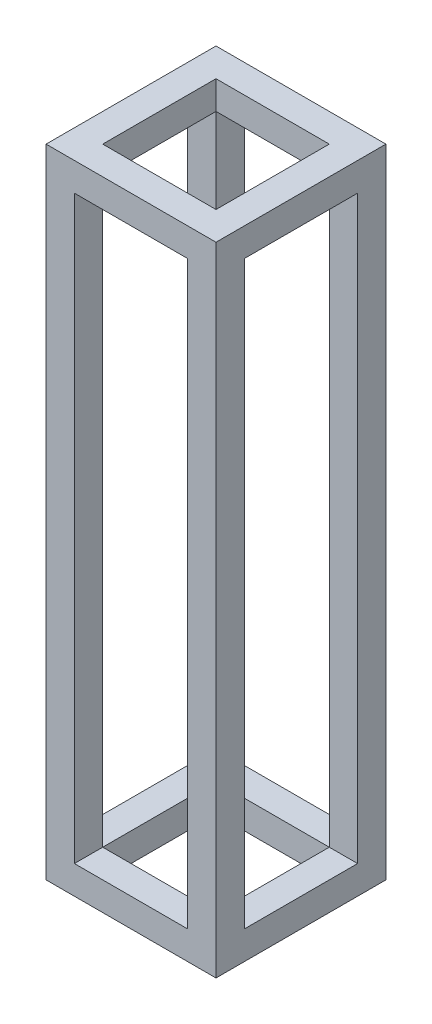
ISO-10303-21;
HEADER;
FILE_DESCRIPTION(('STEP AP214'),'2;1');
FILE_NAME('part.step','',(''),(''),'','','');
FILE_SCHEMA(('AUTOMOTIVE_DESIGN { 1 0 10303 214 1 1 1 1 }'));
ENDSEC;
DATA;
#1=APPLICATION_CONTEXT('core data for automotive mechanical design processes');
#2=APPLICATION_PROTOCOL_DEFINITION('international standard','automotive_design',2000,#1);
#3=PRODUCT_CONTEXT('',#1,'mechanical');
#4=PRODUCT('Part','Part','',(#3));
#5=PRODUCT_RELATED_PRODUCT_CATEGORY('part','',(#4));
#6=PRODUCT_DEFINITION_FORMATION('','',#4);
#7=PRODUCT_DEFINITION_CONTEXT('part definition',#1,'design');
#8=PRODUCT_DEFINITION('design','',#6,#7);
#9=PRODUCT_DEFINITION_SHAPE('','',#8);
#10=(LENGTH_UNIT() NAMED_UNIT(*) SI_UNIT(.MILLI.,.METRE.));
#11=(NAMED_UNIT(*) PLANE_ANGLE_UNIT() SI_UNIT($,.RADIAN.));
#12=(NAMED_UNIT(*) SI_UNIT($,.STERADIAN.) SOLID_ANGLE_UNIT());
#13=UNCERTAINTY_MEASURE_WITH_UNIT(LENGTH_MEASURE(1.E-05),#10,'distance_accuracy_value','');
#14=(GEOMETRIC_REPRESENTATION_CONTEXT(3) GLOBAL_UNCERTAINTY_ASSIGNED_CONTEXT((#13)) GLOBAL_UNIT_ASSIGNED_CONTEXT((#10,
#11,#12)) REPRESENTATION_CONTEXT('',''));
#15=CARTESIAN_POINT('',(0.,0.,0.));
#16=DIRECTION('',(0.,0.,1.));
#17=DIRECTION('',(1.,0.,0.));
#18=AXIS2_PLACEMENT_3D('',#15,#16,#17);
#19=CARTESIAN_POINT('',(-40.,0.,-60.));
#20=DIRECTION('',(1.,0.,0.));
#21=DIRECTION('',(0.,0.,-1.));
#22=AXIS2_PLACEMENT_3D('',#19,#20,#21);
#23=PLANE('',#22);
#24=DIRECTION('',(0.,1.,0.));
#25=VECTOR('',#24,1.);
#26=CARTESIAN_POINT('',(-40.,0.,-60.));
#27=LINE('',#26,#25);
#28=CARTESIAN_POINT('',(-40.,20.,-60.));
#29=VERTEX_POINT('',#28);
#30=CARTESIAN_POINT('',(-40.,430.,-60.));
#31=VERTEX_POINT('',#30);
#32=EDGE_CURVE('E253',#29,#31,#27,.T.);
#33=ORIENTED_EDGE('',*,*,#32,.T.);
#34=DIRECTION('',(0.,0.,1.));
#35=VECTOR('',#34,1.);
#36=CARTESIAN_POINT('',(-40.,430.,-60.));
#37=LINE('',#36,#35);
#38=CARTESIAN_POINT('',(-40.,430.,-40.));
#39=VERTEX_POINT('',#38);
#40=EDGE_CURVE('E246',#31,#39,#37,.T.);
#41=ORIENTED_EDGE('',*,*,#40,.T.);
#42=DIRECTION('',(0.,1.,0.));
#43=VECTOR('',#42,1.);
#44=CARTESIAN_POINT('',(-40.,0.,-40.));
#45=LINE('',#44,#43);
#46=CARTESIAN_POINT('',(-40.,20.,-40.));
#47=VERTEX_POINT('',#46);
#48=EDGE_CURVE('E254',#47,#39,#45,.T.);
#49=ORIENTED_EDGE('',*,*,#48,.F.);
#50=DIRECTION('',(0.,0.,-1.));
#51=VECTOR('',#50,1.);
#52=CARTESIAN_POINT('',(-40.,20.,0.));
#53=LINE('',#52,#51);
#54=EDGE_CURVE('E326',#47,#29,#53,.T.);
#55=ORIENTED_EDGE('',*,*,#54,.T.);
#56=EDGE_LOOP('',(#33,#41,#49,#55));
#57=FACE_BOUND('',#56,.T.);
#58=ADVANCED_FACE('F39',(#57),#23,.T.);
#59=CARTESIAN_POINT('',(-60.,0.,-40.));
#60=DIRECTION('',(0.,0.,1.));
#61=DIRECTION('',(1.,0.,0.));
#62=AXIS2_PLACEMENT_3D('',#59,#60,#61);
#63=PLANE('',#62);
#64=ORIENTED_EDGE('',*,*,#48,.T.);
#65=DIRECTION('',(-1.,0.,0.));
#66=VECTOR('',#65,1.);
#67=CARTESIAN_POINT('',(-60.,430.,-40.));
#68=LINE('',#67,#66);
#69=CARTESIAN_POINT('',(-60.,430.,-40.));
#70=VERTEX_POINT('',#69);
#71=EDGE_CURVE('E371',#39,#70,#68,.T.);
#72=ORIENTED_EDGE('',*,*,#71,.T.);
#73=DIRECTION('',(0.,1.,0.));
#74=VECTOR('',#73,1.);
#75=CARTESIAN_POINT('',(-60.,0.,-40.));
#76=LINE('',#75,#74);
#77=CARTESIAN_POINT('',(-60.,20.,-40.));
#78=VERTEX_POINT('',#77);
#79=EDGE_CURVE('E256',#78,#70,#76,.T.);
#80=ORIENTED_EDGE('',*,*,#79,.F.);
#81=DIRECTION('',(1.,0.,0.));
#82=VECTOR('',#81,1.);
#83=CARTESIAN_POINT('',(0.,20.,-40.));
#84=LINE('',#83,#82);
#85=EDGE_CURVE('E323',#78,#47,#84,.T.);
#86=ORIENTED_EDGE('',*,*,#85,.T.);
#87=EDGE_LOOP('',(#64,#72,#80,#86));
#88=FACE_BOUND('',#87,.T.);
#89=ADVANCED_FACE('F425',(#88),#63,.T.);
#90=CARTESIAN_POINT('',(40.,0.,-40.));
#91=DIRECTION('',(-1.,0.,0.));
#92=DIRECTION('',(0.,0.,1.));
#93=AXIS2_PLACEMENT_3D('',#90,#91,#92);
#94=PLANE('',#93);
#95=DIRECTION('',(0.,1.,0.));
#96=VECTOR('',#95,1.);
#97=CARTESIAN_POINT('',(40.,0.,-40.));
#98=LINE('',#97,#96);
#99=CARTESIAN_POINT('',(40.,20.,-40.));
#100=VERTEX_POINT('',#99);
#101=CARTESIAN_POINT('',(40.,430.,-40.));
#102=VERTEX_POINT('',#101);
#103=EDGE_CURVE('E374',#100,#102,#98,.T.);
#104=ORIENTED_EDGE('',*,*,#103,.T.);
#105=DIRECTION('',(0.,0.,-1.));
#106=VECTOR('',#105,1.);
#107=CARTESIAN_POINT('',(40.,430.,-40.));
#108=LINE('',#107,#106);
#109=CARTESIAN_POINT('',(40.,430.,-60.));
#110=VERTEX_POINT('',#109);
#111=EDGE_CURVE('E366',#102,#110,#108,.T.);
#112=ORIENTED_EDGE('',*,*,#111,.T.);
#113=DIRECTION('',(0.,1.,0.));
#114=VECTOR('',#113,1.);
#115=CARTESIAN_POINT('',(40.,0.,-60.));
#116=LINE('',#115,#114);
#117=CARTESIAN_POINT('',(40.,20.,-60.));
#118=VERTEX_POINT('',#117);
#119=EDGE_CURVE('E239',#118,#110,#116,.T.);
#120=ORIENTED_EDGE('',*,*,#119,.F.);
#121=DIRECTION('',(0.,0.,1.));
#122=VECTOR('',#121,1.);
#123=CARTESIAN_POINT('',(40.,20.,0.));
#124=LINE('',#123,#122);
#125=EDGE_CURVE('E335',#118,#100,#124,.T.);
#126=ORIENTED_EDGE('',*,*,#125,.T.);
#127=EDGE_LOOP('',(#104,#112,#120,#126));
#128=FACE_BOUND('',#127,.T.);
#129=ADVANCED_FACE('F427',(#128),#94,.T.);
#130=CARTESIAN_POINT('',(40.,0.,-40.));
#131=DIRECTION('',(0.,0.,1.));
#132=DIRECTION('',(1.,0.,0.));
#133=AXIS2_PLACEMENT_3D('',#130,#131,#132);
#134=PLANE('',#133);
#135=DIRECTION('',(0.,1.,0.));
#136=VECTOR('',#135,1.);
#137=CARTESIAN_POINT('',(60.,0.,-40.));
#138=LINE('',#137,#136);
#139=CARTESIAN_POINT('',(60.,20.,-40.));
#140=VERTEX_POINT('',#139);
#141=CARTESIAN_POINT('',(60.,430.,-40.));
#142=VERTEX_POINT('',#141);
#143=EDGE_CURVE('E378',#140,#142,#138,.T.);
#144=ORIENTED_EDGE('',*,*,#143,.T.);
#145=DIRECTION('',(-1.,0.,0.));
#146=VECTOR('',#145,1.);
#147=CARTESIAN_POINT('',(40.,430.,-40.));
#148=LINE('',#147,#146);
#149=EDGE_CURVE('E224',#142,#102,#148,.T.);
#150=ORIENTED_EDGE('',*,*,#149,.T.);
#151=ORIENTED_EDGE('',*,*,#103,.F.);
#152=DIRECTION('',(1.,0.,0.));
#153=VECTOR('',#152,1.);
#154=CARTESIAN_POINT('',(0.,20.,-40.));
#155=LINE('',#154,#153);
#156=EDGE_CURVE('E328',#100,#140,#155,.T.);
#157=ORIENTED_EDGE('',*,*,#156,.T.);
#158=EDGE_LOOP('',(#144,#150,#151,#157));
#159=FACE_BOUND('',#158,.T.);
#160=ADVANCED_FACE('F475',(#159),#134,.T.);
#161=CARTESIAN_POINT('',(40.,0.,40.));
#162=DIRECTION('',(-1.,0.,0.));
#163=DIRECTION('',(0.,0.,1.));
#164=AXIS2_PLACEMENT_3D('',#161,#162,#163);
#165=PLANE('',#164);
#166=DIRECTION('',(0.,1.,0.));
#167=VECTOR('',#166,1.);
#168=CARTESIAN_POINT('',(40.,0.,60.));
#169=LINE('',#168,#167);
#170=CARTESIAN_POINT('',(40.,20.,60.));
#171=VERTEX_POINT('',#170);
#172=CARTESIAN_POINT('',(40.,430.,60.));
#173=VERTEX_POINT('',#172);
#174=EDGE_CURVE('E225',#171,#173,#169,.T.);
#175=ORIENTED_EDGE('',*,*,#174,.T.);
#176=DIRECTION('',(0.,0.,-1.));
#177=VECTOR('',#176,1.);
#178=CARTESIAN_POINT('',(40.,430.,40.));
#179=LINE('',#178,#177);
#180=CARTESIAN_POINT('',(40.,430.,40.));
#181=VERTEX_POINT('',#180);
#182=EDGE_CURVE('E181',#173,#181,#179,.T.);
#183=ORIENTED_EDGE('',*,*,#182,.T.);
#184=DIRECTION('',(0.,1.,0.));
#185=VECTOR('',#184,1.);
#186=CARTESIAN_POINT('',(40.,0.,40.));
#187=LINE('',#186,#185);
#188=CARTESIAN_POINT('',(40.,20.,40.));
#189=VERTEX_POINT('',#188);
#190=EDGE_CURVE('E219',#189,#181,#187,.T.);
#191=ORIENTED_EDGE('',*,*,#190,.F.);
#192=DIRECTION('',(0.,0.,1.));
#193=VECTOR('',#192,1.);
#194=CARTESIAN_POINT('',(40.,20.,0.));
#195=LINE('',#194,#193);
#196=EDGE_CURVE('E339',#189,#171,#195,.T.);
#197=ORIENTED_EDGE('',*,*,#196,.T.);
#198=EDGE_LOOP('',(#175,#183,#191,#197));
#199=FACE_BOUND('',#198,.T.);
#200=ADVANCED_FACE('F217',(#199),#165,.T.);
#201=CARTESIAN_POINT('',(40.,0.,40.));
#202=DIRECTION('',(0.,0.,-1.));
#203=DIRECTION('',(-1.,0.,0.));
#204=AXIS2_PLACEMENT_3D('',#201,#202,#203);
#205=PLANE('',#204);
#206=ORIENTED_EDGE('',*,*,#190,.T.);
#207=DIRECTION('',(1.,0.,0.));
#208=VECTOR('',#207,1.);
#209=CARTESIAN_POINT('',(40.,430.,40.));
#210=LINE('',#209,#208);
#211=CARTESIAN_POINT('',(60.,430.,40.));
#212=VERTEX_POINT('',#211);
#213=EDGE_CURVE('E173',#181,#212,#210,.T.);
#214=ORIENTED_EDGE('',*,*,#213,.T.);
#215=DIRECTION('',(0.,1.,0.));
#216=VECTOR('',#215,1.);
#217=CARTESIAN_POINT('',(60.,0.,40.));
#218=LINE('',#217,#216);
#219=CARTESIAN_POINT('',(60.,20.,40.));
#220=VERTEX_POINT('',#219);
#221=EDGE_CURVE('E230',#220,#212,#218,.T.);
#222=ORIENTED_EDGE('',*,*,#221,.F.);
#223=DIRECTION('',(-1.,0.,0.));
#224=VECTOR('',#223,1.);
#225=CARTESIAN_POINT('',(0.,20.,40.));
#226=LINE('',#225,#224);
#227=EDGE_CURVE('E226',#220,#189,#226,.T.);
#228=ORIENTED_EDGE('',*,*,#227,.T.);
#229=EDGE_LOOP('',(#206,#214,#222,#228));
#230=FACE_BOUND('',#229,.T.);
#231=ADVANCED_FACE('F229',(#230),#205,.T.);
#232=CARTESIAN_POINT('',(-40.,0.,40.));
#233=DIRECTION('',(1.,0.,0.));
#234=DIRECTION('',(0.,0.,-1.));
#235=AXIS2_PLACEMENT_3D('',#232,#233,#234);
#236=PLANE('',#235);
#237=DIRECTION('',(0.,1.,0.));
#238=VECTOR('',#237,1.);
#239=CARTESIAN_POINT('',(-40.,0.,40.));
#240=LINE('',#239,#238);
#241=CARTESIAN_POINT('',(-40.,20.,40.));
#242=VERTEX_POINT('',#241);
#243=CARTESIAN_POINT('',(-40.,430.,40.));
#244=VERTEX_POINT('',#243);
#245=EDGE_CURVE('E238',#242,#244,#240,.T.);
#246=ORIENTED_EDGE('',*,*,#245,.T.);
#247=DIRECTION('',(0.,0.,1.));
#248=VECTOR('',#247,1.);
#249=CARTESIAN_POINT('',(-40.,430.,40.));
#250=LINE('',#249,#248);
#251=CARTESIAN_POINT('',(-40.,430.,60.));
#252=VERTEX_POINT('',#251);
#253=EDGE_CURVE('E184',#244,#252,#250,.T.);
#254=ORIENTED_EDGE('',*,*,#253,.T.);
#255=DIRECTION('',(0.,1.,0.));
#256=VECTOR('',#255,1.);
#257=CARTESIAN_POINT('',(-40.,0.,60.));
#258=LINE('',#257,#256);
#259=CARTESIAN_POINT('',(-40.,20.,60.));
#260=VERTEX_POINT('',#259);
#261=EDGE_CURVE('E247',#260,#252,#258,.T.);
#262=ORIENTED_EDGE('',*,*,#261,.F.);
#263=DIRECTION('',(0.,0.,-1.));
#264=VECTOR('',#263,1.);
#265=CARTESIAN_POINT('',(-40.,20.,0.));
#266=LINE('',#265,#264);
#267=EDGE_CURVE('E50',#260,#242,#266,.T.);
#268=ORIENTED_EDGE('',*,*,#267,.T.);
#269=EDGE_LOOP('',(#246,#254,#262,#268));
#270=FACE_BOUND('',#269,.T.);
#271=ADVANCED_FACE('F341',(#270),#236,.T.);
#272=CARTESIAN_POINT('',(-40.,0.,40.));
#273=DIRECTION('',(0.,0.,-1.));
#274=DIRECTION('',(-1.,0.,0.));
#275=AXIS2_PLACEMENT_3D('',#272,#273,#274);
#276=PLANE('',#275);
#277=DIRECTION('',(0.,1.,0.));
#278=VECTOR('',#277,1.);
#279=CARTESIAN_POINT('',(-60.,0.,40.));
#280=LINE('',#279,#278);
#281=CARTESIAN_POINT('',(-60.,20.,40.));
#282=VERTEX_POINT('',#281);
#283=CARTESIAN_POINT('',(-60.,430.,40.));
#284=VERTEX_POINT('',#283);
#285=EDGE_CURVE('E245',#282,#284,#280,.T.);
#286=ORIENTED_EDGE('',*,*,#285,.T.);
#287=DIRECTION('',(1.,0.,0.));
#288=VECTOR('',#287,1.);
#289=CARTESIAN_POINT('',(-40.,430.,40.));
#290=LINE('',#289,#288);
#291=EDGE_CURVE('E11',#284,#244,#290,.T.);
#292=ORIENTED_EDGE('',*,*,#291,.T.);
#293=ORIENTED_EDGE('',*,*,#245,.F.);
#294=DIRECTION('',(-1.,0.,0.));
#295=VECTOR('',#294,1.);
#296=CARTESIAN_POINT('',(0.,20.,40.));
#297=LINE('',#296,#295);
#298=EDGE_CURVE('E340',#242,#282,#297,.T.);
#299=ORIENTED_EDGE('',*,*,#298,.T.);
#300=EDGE_LOOP('',(#286,#292,#293,#299));
#301=FACE_BOUND('',#300,.T.);
#302=ADVANCED_FACE('F349',(#301),#276,.T.);
#303=CARTESIAN_POINT('',(0.,20.,0.));
#304=DIRECTION('',(0.,1.,0.));
#305=DIRECTION('',(0.,0.,1.));
#306=AXIS2_PLACEMENT_3D('',#303,#304,#305);
#307=PLANE('',#306);
#308=ORIENTED_EDGE('',*,*,#267,.F.);
#309=DIRECTION('',(1.,0.,0.));
#310=VECTOR('',#309,1.);
#311=CARTESIAN_POINT('',(-60.,20.,60.));
#312=LINE('',#311,#310);
#313=EDGE_CURVE('E305',#260,#171,#312,.T.);
#314=ORIENTED_EDGE('',*,*,#313,.T.);
#315=ORIENTED_EDGE('',*,*,#196,.F.);
#316=DIRECTION('',(1.,0.,0.));
#317=VECTOR('',#316,1.);
#318=CARTESIAN_POINT('',(-40.,20.,40.));
#319=LINE('',#318,#317);
#320=EDGE_CURVE('E275',#242,#189,#319,.T.);
#321=ORIENTED_EDGE('',*,*,#320,.F.);
#322=EDGE_LOOP('',(#308,#314,#315,#321));
#323=FACE_BOUND('',#322,.T.);
#324=ADVANCED_FACE('F420',(#323),#307,.T.);
#325=ORIENTED_EDGE('',*,*,#298,.F.);
#326=DIRECTION('',(0.,0.,1.));
#327=VECTOR('',#326,1.);
#328=CARTESIAN_POINT('',(-40.,20.,-40.));
#329=LINE('',#328,#327);
#330=EDGE_CURVE('E267',#47,#242,#329,.T.);
#331=ORIENTED_EDGE('',*,*,#330,.F.);
#332=ORIENTED_EDGE('',*,*,#85,.F.);
#333=DIRECTION('',(0.,0.,1.));
#334=VECTOR('',#333,1.);
#335=CARTESIAN_POINT('',(-60.,20.,-60.));
#336=LINE('',#335,#334);
#337=EDGE_CURVE('E302',#78,#282,#336,.T.);
#338=ORIENTED_EDGE('',*,*,#337,.T.);
#339=EDGE_LOOP('',(#325,#331,#332,#338));
#340=FACE_BOUND('',#339,.T.);
#341=ADVANCED_FACE('F458',(#340),#307,.T.);
#342=ORIENTED_EDGE('',*,*,#125,.F.);
#343=DIRECTION('',(-1.,0.,0.));
#344=VECTOR('',#343,1.);
#345=CARTESIAN_POINT('',(-60.,20.,-60.));
#346=LINE('',#345,#344);
#347=EDGE_CURVE('E300',#118,#29,#346,.T.);
#348=ORIENTED_EDGE('',*,*,#347,.T.);
#349=ORIENTED_EDGE('',*,*,#54,.F.);
#350=DIRECTION('',(-1.,0.,0.));
#351=VECTOR('',#350,1.);
#352=CARTESIAN_POINT('',(-40.,20.,-40.));
#353=LINE('',#352,#351);
#354=EDGE_CURVE('E264',#100,#47,#353,.T.);
#355=ORIENTED_EDGE('',*,*,#354,.F.);
#356=EDGE_LOOP('',(#342,#348,#349,#355));
#357=FACE_BOUND('',#356,.T.);
#358=ADVANCED_FACE('F418',(#357),#307,.T.);
#359=ORIENTED_EDGE('',*,*,#227,.F.);
#360=DIRECTION('',(0.,0.,-1.));
#361=VECTOR('',#360,1.);
#362=CARTESIAN_POINT('',(60.,20.,-60.));
#363=LINE('',#362,#361);
#364=EDGE_CURVE('E299',#220,#140,#363,.T.);
#365=ORIENTED_EDGE('',*,*,#364,.T.);
#366=ORIENTED_EDGE('',*,*,#156,.F.);
#367=DIRECTION('',(0.,0.,-1.));
#368=VECTOR('',#367,1.);
#369=CARTESIAN_POINT('',(40.,20.,-40.));
#370=LINE('',#369,#368);
#371=EDGE_CURVE('E265',#189,#100,#370,.T.);
#372=ORIENTED_EDGE('',*,*,#371,.F.);
#373=EDGE_LOOP('',(#359,#365,#366,#372));
#374=FACE_BOUND('',#373,.T.);
#375=ADVANCED_FACE('F410',(#374),#307,.T.);
#376=CARTESIAN_POINT('',(0.,0.,0.));
#377=DIRECTION('',(0.,1.,0.));
#378=DIRECTION('',(0.,0.,1.));
#379=AXIS2_PLACEMENT_3D('',#376,#377,#378);
#380=PLANE('',#379);
#381=DIRECTION('',(0.,0.,1.));
#382=VECTOR('',#381,1.);
#383=CARTESIAN_POINT('',(-40.,0.,-40.));
#384=LINE('',#383,#382);
#385=CARTESIAN_POINT('',(-40.,0.,-40.));
#386=VERTEX_POINT('',#385);
#387=CARTESIAN_POINT('',(-40.,0.,40.));
#388=VERTEX_POINT('',#387);
#389=EDGE_CURVE('E284',#386,#388,#384,.T.);
#390=ORIENTED_EDGE('',*,*,#389,.T.);
#391=DIRECTION('',(1.,0.,0.));
#392=VECTOR('',#391,1.);
#393=CARTESIAN_POINT('',(-40.,0.,40.));
#394=LINE('',#393,#392);
#395=CARTESIAN_POINT('',(40.,0.,40.));
#396=VERTEX_POINT('',#395);
#397=EDGE_CURVE('E266',#388,#396,#394,.T.);
#398=ORIENTED_EDGE('',*,*,#397,.T.);
#399=DIRECTION('',(0.,0.,-1.));
#400=VECTOR('',#399,1.);
#401=CARTESIAN_POINT('',(40.,0.,-40.));
#402=LINE('',#401,#400);
#403=CARTESIAN_POINT('',(40.,0.,-40.));
#404=VERTEX_POINT('',#403);
#405=EDGE_CURVE('E255',#396,#404,#402,.T.);
#406=ORIENTED_EDGE('',*,*,#405,.T.);
#407=DIRECTION('',(-1.,0.,0.));
#408=VECTOR('',#407,1.);
#409=CARTESIAN_POINT('',(-40.,0.,-40.));
#410=LINE('',#409,#408);
#411=EDGE_CURVE('E279',#404,#386,#410,.T.);
#412=ORIENTED_EDGE('',*,*,#411,.T.);
#413=EDGE_LOOP('',(#390,#398,#406,#412));
#414=FACE_BOUND('',#413,.T.);
#415=DIRECTION('',(-1.,0.,0.));
#416=VECTOR('',#415,1.);
#417=CARTESIAN_POINT('',(-60.,0.,-60.));
#418=LINE('',#417,#416);
#419=CARTESIAN_POINT('',(60.,0.,-60.));
#420=VERTEX_POINT('',#419);
#421=CARTESIAN_POINT('',(-60.,0.,-60.));
#422=VERTEX_POINT('',#421);
#423=EDGE_CURVE('E306',#420,#422,#418,.T.);
#424=ORIENTED_EDGE('',*,*,#423,.F.);
#425=DIRECTION('',(0.,0.,-1.));
#426=VECTOR('',#425,1.);
#427=CARTESIAN_POINT('',(60.,0.,-60.));
#428=LINE('',#427,#426);
#429=CARTESIAN_POINT('',(60.,0.,60.));
#430=VERTEX_POINT('',#429);
#431=EDGE_CURVE('E293',#430,#420,#428,.T.);
#432=ORIENTED_EDGE('',*,*,#431,.F.);
#433=DIRECTION('',(1.,0.,0.));
#434=VECTOR('',#433,1.);
#435=CARTESIAN_POINT('',(-60.,0.,60.));
#436=LINE('',#435,#434);
#437=CARTESIAN_POINT('',(-60.,0.,60.));
#438=VERTEX_POINT('',#437);
#439=EDGE_CURVE('E298',#438,#430,#436,.T.);
#440=ORIENTED_EDGE('',*,*,#439,.F.);
#441=DIRECTION('',(0.,0.,1.));
#442=VECTOR('',#441,1.);
#443=CARTESIAN_POINT('',(-60.,0.,-60.));
#444=LINE('',#443,#442);
#445=EDGE_CURVE('E313',#422,#438,#444,.T.);
#446=ORIENTED_EDGE('',*,*,#445,.F.);
#447=EDGE_LOOP('',(#424,#432,#440,#446));
#448=FACE_BOUND('',#447,.T.);
#449=ADVANCED_FACE('F409',(#414,#448),#380,.F.);
#450=CARTESIAN_POINT('',(60.,20.,-60.));
#451=DIRECTION('',(-1.,0.,0.));
#452=DIRECTION('',(0.,0.,1.));
#453=AXIS2_PLACEMENT_3D('',#450,#451,#452);
#454=PLANE('',#453);
#455=DIRECTION('',(0.,-1.,0.));
#456=VECTOR('',#455,1.);
#457=CARTESIAN_POINT('',(60.,20.,-60.));
#458=LINE('',#457,#456);
#459=CARTESIAN_POINT('',(60.,450.,-60.));
#460=VERTEX_POINT('',#459);
#461=EDGE_CURVE('E321',#460,#420,#458,.T.);
#462=ORIENTED_EDGE('',*,*,#461,.F.);
#463=DIRECTION('',(0.,0.,-1.));
#464=VECTOR('',#463,1.);
#465=CARTESIAN_POINT('',(60.,450.,40.));
#466=LINE('',#465,#464);
#467=CARTESIAN_POINT('',(60.,450.,60.));
#468=VERTEX_POINT('',#467);
#469=EDGE_CURVE('E240',#468,#460,#466,.T.);
#470=ORIENTED_EDGE('',*,*,#469,.F.);
#471=DIRECTION('',(0.,-1.,0.));
#472=VECTOR('',#471,1.);
#473=CARTESIAN_POINT('',(60.,20.,60.));
#474=LINE('',#473,#472);
#475=EDGE_CURVE('E303',#468,#430,#474,.T.);
#476=ORIENTED_EDGE('',*,*,#475,.T.);
#477=ORIENTED_EDGE('',*,*,#431,.T.);
#478=EDGE_LOOP('',(#462,#470,#476,#477));
#479=FACE_BOUND('',#478,.T.);
#480=DIRECTION('',(0.,0.,-1.));
#481=VECTOR('',#480,1.);
#482=CARTESIAN_POINT('',(60.,430.,-60.));
#483=LINE('',#482,#481);
#484=EDGE_CURVE('E180',#212,#142,#483,.T.);
#485=ORIENTED_EDGE('',*,*,#484,.T.);
#486=ORIENTED_EDGE('',*,*,#143,.F.);
#487=ORIENTED_EDGE('',*,*,#364,.F.);
#488=ORIENTED_EDGE('',*,*,#221,.T.);
#489=EDGE_LOOP('',(#485,#486,#487,#488));
#490=FACE_BOUND('',#489,.T.);
#491=ADVANCED_FACE('F41',(#479,#490),#454,.F.);
#492=CARTESIAN_POINT('',(-60.,20.,-60.));
#493=DIRECTION('',(0.,0.,1.));
#494=DIRECTION('',(1.,0.,0.));
#495=AXIS2_PLACEMENT_3D('',#492,#493,#494);
#496=PLANE('',#495);
#497=DIRECTION('',(0.,-1.,0.));
#498=VECTOR('',#497,1.);
#499=CARTESIAN_POINT('',(-60.,20.,-60.));
#500=LINE('',#499,#498);
#501=CARTESIAN_POINT('',(-60.,450.,-60.));
#502=VERTEX_POINT('',#501);
#503=EDGE_CURVE('E317',#502,#422,#500,.T.);
#504=ORIENTED_EDGE('',*,*,#503,.F.);
#505=DIRECTION('',(-1.,0.,0.));
#506=VECTOR('',#505,1.);
#507=CARTESIAN_POINT('',(40.,450.,-60.));
#508=LINE('',#507,#506);
#509=EDGE_CURVE('E261',#460,#502,#508,.T.);
#510=ORIENTED_EDGE('',*,*,#509,.F.);
#511=ORIENTED_EDGE('',*,*,#461,.T.);
#512=ORIENTED_EDGE('',*,*,#423,.T.);
#513=EDGE_LOOP('',(#504,#510,#511,#512));
#514=FACE_BOUND('',#513,.T.);
#515=DIRECTION('',(-1.,0.,0.));
#516=VECTOR('',#515,1.);
#517=CARTESIAN_POINT('',(-60.,430.,-60.));
#518=LINE('',#517,#516);
#519=EDGE_CURVE('E360',#110,#31,#518,.T.);
#520=ORIENTED_EDGE('',*,*,#519,.T.);
#521=ORIENTED_EDGE('',*,*,#32,.F.);
#522=ORIENTED_EDGE('',*,*,#347,.F.);
#523=ORIENTED_EDGE('',*,*,#119,.T.);
#524=EDGE_LOOP('',(#520,#521,#522,#523));
#525=FACE_BOUND('',#524,.T.);
#526=ADVANCED_FACE('F391',(#514,#525),#496,.F.);
#527=CARTESIAN_POINT('',(-60.,20.,-60.));
#528=DIRECTION('',(1.,0.,0.));
#529=DIRECTION('',(0.,0.,-1.));
#530=AXIS2_PLACEMENT_3D('',#527,#528,#529);
#531=PLANE('',#530);
#532=DIRECTION('',(0.,0.,1.));
#533=VECTOR('',#532,1.);
#534=CARTESIAN_POINT('',(-60.,450.,40.));
#535=LINE('',#534,#533);
#536=CARTESIAN_POINT('',(-60.,450.,60.));
#537=VERTEX_POINT('',#536);
#538=EDGE_CURVE('E228',#502,#537,#535,.T.);
#539=ORIENTED_EDGE('',*,*,#538,.F.);
#540=ORIENTED_EDGE('',*,*,#503,.T.);
#541=ORIENTED_EDGE('',*,*,#445,.T.);
#542=DIRECTION('',(0.,-1.,0.));
#543=VECTOR('',#542,1.);
#544=CARTESIAN_POINT('',(-60.,20.,60.));
#545=LINE('',#544,#543);
#546=EDGE_CURVE('E320',#537,#438,#545,.T.);
#547=ORIENTED_EDGE('',*,*,#546,.F.);
#548=EDGE_LOOP('',(#539,#540,#541,#547));
#549=FACE_BOUND('',#548,.T.);
#550=DIRECTION('',(0.,0.,1.));
#551=VECTOR('',#550,1.);
#552=CARTESIAN_POINT('',(-60.,430.,-60.));
#553=LINE('',#552,#551);
#554=EDGE_CURVE('E53',#70,#284,#553,.T.);
#555=ORIENTED_EDGE('',*,*,#554,.T.);
#556=ORIENTED_EDGE('',*,*,#285,.F.);
#557=ORIENTED_EDGE('',*,*,#337,.F.);
#558=ORIENTED_EDGE('',*,*,#79,.T.);
#559=EDGE_LOOP('',(#555,#556,#557,#558));
#560=FACE_BOUND('',#559,.T.);
#561=ADVANCED_FACE('F353',(#549,#560),#531,.F.);
#562=CARTESIAN_POINT('',(-60.,20.,60.));
#563=DIRECTION('',(0.,0.,-1.));
#564=DIRECTION('',(-1.,0.,0.));
#565=AXIS2_PLACEMENT_3D('',#562,#563,#564);
#566=PLANE('',#565);
#567=ORIENTED_EDGE('',*,*,#475,.F.);
#568=DIRECTION('',(1.,0.,0.));
#569=VECTOR('',#568,1.);
#570=CARTESIAN_POINT('',(-40.,450.,60.));
#571=LINE('',#570,#569);
#572=EDGE_CURVE('E235',#537,#468,#571,.T.);
#573=ORIENTED_EDGE('',*,*,#572,.F.);
#574=ORIENTED_EDGE('',*,*,#546,.T.);
#575=ORIENTED_EDGE('',*,*,#439,.T.);
#576=EDGE_LOOP('',(#567,#573,#574,#575));
#577=FACE_BOUND('',#576,.T.);
#578=DIRECTION('',(1.,0.,0.));
#579=VECTOR('',#578,1.);
#580=CARTESIAN_POINT('',(-60.,430.,60.));
#581=LINE('',#580,#579);
#582=EDGE_CURVE('E359',#252,#173,#581,.T.);
#583=ORIENTED_EDGE('',*,*,#582,.T.);
#584=ORIENTED_EDGE('',*,*,#174,.F.);
#585=ORIENTED_EDGE('',*,*,#313,.F.);
#586=ORIENTED_EDGE('',*,*,#261,.T.);
#587=EDGE_LOOP('',(#583,#584,#585,#586));
#588=FACE_BOUND('',#587,.T.);
#589=ADVANCED_FACE('F398',(#577,#588),#566,.F.);
#590=CARTESIAN_POINT('',(40.,20.,-40.));
#591=DIRECTION('',(-1.,0.,0.));
#592=DIRECTION('',(0.,0.,1.));
#593=AXIS2_PLACEMENT_3D('',#590,#591,#592);
#594=PLANE('',#593);
#595=ORIENTED_EDGE('',*,*,#405,.F.);
#596=DIRECTION('',(0.,-1.,0.));
#597=VECTOR('',#596,1.);
#598=CARTESIAN_POINT('',(40.,20.,40.));
#599=LINE('',#598,#597);
#600=EDGE_CURVE('E274',#189,#396,#599,.T.);
#601=ORIENTED_EDGE('',*,*,#600,.F.);
#602=ORIENTED_EDGE('',*,*,#371,.T.);
#603=DIRECTION('',(0.,-1.,0.));
#604=VECTOR('',#603,1.);
#605=CARTESIAN_POINT('',(40.,20.,-40.));
#606=LINE('',#605,#604);
#607=EDGE_CURVE('E295',#100,#404,#606,.T.);
#608=ORIENTED_EDGE('',*,*,#607,.T.);
#609=EDGE_LOOP('',(#595,#601,#602,#608));
#610=FACE_BOUND('',#609,.T.);
#611=ADVANCED_FACE('F443',(#610),#594,.T.);
#612=CARTESIAN_POINT('',(-40.,20.,-40.));
#613=DIRECTION('',(0.,0.,1.));
#614=DIRECTION('',(1.,0.,0.));
#615=AXIS2_PLACEMENT_3D('',#612,#613,#614);
#616=PLANE('',#615);
#617=ORIENTED_EDGE('',*,*,#411,.F.);
#618=ORIENTED_EDGE('',*,*,#607,.F.);
#619=ORIENTED_EDGE('',*,*,#354,.T.);
#620=DIRECTION('',(0.,-1.,0.));
#621=VECTOR('',#620,1.);
#622=CARTESIAN_POINT('',(-40.,20.,-40.));
#623=LINE('',#622,#621);
#624=EDGE_CURVE('E288',#47,#386,#623,.T.);
#625=ORIENTED_EDGE('',*,*,#624,.T.);
#626=EDGE_LOOP('',(#617,#618,#619,#625));
#627=FACE_BOUND('',#626,.T.);
#628=ADVANCED_FACE('F442',(#627),#616,.T.);
#629=CARTESIAN_POINT('',(-40.,20.,-40.));
#630=DIRECTION('',(1.,0.,0.));
#631=DIRECTION('',(0.,0.,-1.));
#632=AXIS2_PLACEMENT_3D('',#629,#630,#631);
#633=PLANE('',#632);
#634=ORIENTED_EDGE('',*,*,#389,.F.);
#635=ORIENTED_EDGE('',*,*,#624,.F.);
#636=ORIENTED_EDGE('',*,*,#330,.T.);
#637=DIRECTION('',(0.,-1.,0.));
#638=VECTOR('',#637,1.);
#639=CARTESIAN_POINT('',(-40.,20.,40.));
#640=LINE('',#639,#638);
#641=EDGE_CURVE('E290',#242,#388,#640,.T.);
#642=ORIENTED_EDGE('',*,*,#641,.T.);
#643=EDGE_LOOP('',(#634,#635,#636,#642));
#644=FACE_BOUND('',#643,.T.);
#645=ADVANCED_FACE('F440',(#644),#633,.T.);
#646=CARTESIAN_POINT('',(-40.,20.,40.));
#647=DIRECTION('',(0.,0.,-1.));
#648=DIRECTION('',(-1.,0.,0.));
#649=AXIS2_PLACEMENT_3D('',#646,#647,#648);
#650=PLANE('',#649);
#651=ORIENTED_EDGE('',*,*,#397,.F.);
#652=ORIENTED_EDGE('',*,*,#641,.F.);
#653=ORIENTED_EDGE('',*,*,#320,.T.);
#654=ORIENTED_EDGE('',*,*,#600,.T.);
#655=EDGE_LOOP('',(#651,#652,#653,#654));
#656=FACE_BOUND('',#655,.T.);
#657=ADVANCED_FACE('F434',(#656),#650,.T.);
#658=CARTESIAN_POINT('',(0.,450.,0.));
#659=DIRECTION('',(0.,-1.,0.));
#660=DIRECTION('',(0.,0.,-1.));
#661=AXIS2_PLACEMENT_3D('',#658,#659,#660);
#662=PLANE('',#661);
#663=DIRECTION('',(0.,0.,1.));
#664=VECTOR('',#663,1.);
#665=CARTESIAN_POINT('',(-40.,450.,-40.));
#666=LINE('',#665,#664);
#667=CARTESIAN_POINT('',(-40.,450.,-40.));
#668=VERTEX_POINT('',#667);
#669=CARTESIAN_POINT('',(-40.,450.,40.));
#670=VERTEX_POINT('',#669);
#671=EDGE_CURVE('E738',#668,#670,#666,.T.);
#672=ORIENTED_EDGE('',*,*,#671,.F.);
#673=DIRECTION('',(-1.,0.,0.));
#674=VECTOR('',#673,1.);
#675=CARTESIAN_POINT('',(-40.,450.,-40.));
#676=LINE('',#675,#674);
#677=CARTESIAN_POINT('',(40.,450.,-40.));
#678=VERTEX_POINT('',#677);
#679=EDGE_CURVE('E744',#678,#668,#676,.T.);
#680=ORIENTED_EDGE('',*,*,#679,.F.);
#681=DIRECTION('',(0.,0.,-1.));
#682=VECTOR('',#681,1.);
#683=CARTESIAN_POINT('',(40.,450.,-40.));
#684=LINE('',#683,#682);
#685=CARTESIAN_POINT('',(40.,450.,40.));
#686=VERTEX_POINT('',#685);
#687=EDGE_CURVE('E743',#686,#678,#684,.T.);
#688=ORIENTED_EDGE('',*,*,#687,.F.);
#689=DIRECTION('',(1.,0.,0.));
#690=VECTOR('',#689,1.);
#691=CARTESIAN_POINT('',(-40.,450.,40.));
#692=LINE('',#691,#690);
#693=EDGE_CURVE('E193',#670,#686,#692,.T.);
#694=ORIENTED_EDGE('',*,*,#693,.F.);
#695=EDGE_LOOP('',(#672,#680,#688,#694));
#696=FACE_BOUND('',#695,.T.);
#697=ORIENTED_EDGE('',*,*,#572,.T.);
#698=ORIENTED_EDGE('',*,*,#469,.T.);
#699=ORIENTED_EDGE('',*,*,#509,.T.);
#700=ORIENTED_EDGE('',*,*,#538,.T.);
#701=EDGE_LOOP('',(#697,#698,#699,#700));
#702=FACE_BOUND('',#701,.T.);
#703=ADVANCED_FACE('F390',(#696,#702),#662,.F.);
#704=CARTESIAN_POINT('',(0.,430.,0.));
#705=DIRECTION('',(0.,1.,0.));
#706=DIRECTION('',(0.,0.,1.));
#707=AXIS2_PLACEMENT_3D('',#704,#705,#706);
#708=PLANE('',#707);
#709=ORIENTED_EDGE('',*,*,#40,.F.);
#710=ORIENTED_EDGE('',*,*,#519,.F.);
#711=ORIENTED_EDGE('',*,*,#111,.F.);
#712=DIRECTION('',(-1.,0.,0.));
#713=VECTOR('',#712,1.);
#714=CARTESIAN_POINT('',(-40.,430.,-40.));
#715=LINE('',#714,#713);
#716=EDGE_CURVE('E202',#102,#39,#715,.T.);
#717=ORIENTED_EDGE('',*,*,#716,.T.);
#718=EDGE_LOOP('',(#709,#710,#711,#717));
#719=FACE_BOUND('',#718,.T.);
#720=ADVANCED_FACE('F483',(#719),#708,.F.);
#721=ORIENTED_EDGE('',*,*,#71,.F.);
#722=DIRECTION('',(0.,0.,1.));
#723=VECTOR('',#722,1.);
#724=CARTESIAN_POINT('',(-40.,430.,-40.));
#725=LINE('',#724,#723);
#726=EDGE_CURVE('E213',#39,#244,#725,.T.);
#727=ORIENTED_EDGE('',*,*,#726,.T.);
#728=ORIENTED_EDGE('',*,*,#291,.F.);
#729=ORIENTED_EDGE('',*,*,#554,.F.);
#730=EDGE_LOOP('',(#721,#727,#728,#729));
#731=FACE_BOUND('',#730,.T.);
#732=ADVANCED_FACE('F354',(#731),#708,.F.);
#733=ORIENTED_EDGE('',*,*,#182,.F.);
#734=ORIENTED_EDGE('',*,*,#582,.F.);
#735=ORIENTED_EDGE('',*,*,#253,.F.);
#736=DIRECTION('',(1.,0.,0.));
#737=VECTOR('',#736,1.);
#738=CARTESIAN_POINT('',(-40.,430.,40.));
#739=LINE('',#738,#737);
#740=EDGE_CURVE('E194',#244,#181,#739,.T.);
#741=ORIENTED_EDGE('',*,*,#740,.T.);
#742=EDGE_LOOP('',(#733,#734,#735,#741));
#743=FACE_BOUND('',#742,.T.);
#744=ADVANCED_FACE('F209',(#743),#708,.F.);
#745=ORIENTED_EDGE('',*,*,#149,.F.);
#746=ORIENTED_EDGE('',*,*,#484,.F.);
#747=ORIENTED_EDGE('',*,*,#213,.F.);
#748=DIRECTION('',(0.,0.,-1.));
#749=VECTOR('',#748,1.);
#750=CARTESIAN_POINT('',(40.,430.,-40.));
#751=LINE('',#750,#749);
#752=EDGE_CURVE('E61',#181,#102,#751,.T.);
#753=ORIENTED_EDGE('',*,*,#752,.T.);
#754=EDGE_LOOP('',(#745,#746,#747,#753));
#755=FACE_BOUND('',#754,.T.);
#756=ADVANCED_FACE('F177',(#755),#708,.F.);
#757=CARTESIAN_POINT('',(40.,430.,-40.));
#758=DIRECTION('',(1.,0.,0.));
#759=DIRECTION('',(0.,0.,-1.));
#760=AXIS2_PLACEMENT_3D('',#757,#758,#759);
#761=PLANE('',#760);
#762=ORIENTED_EDGE('',*,*,#687,.T.);
#763=DIRECTION('',(0.,1.,0.));
#764=VECTOR('',#763,1.);
#765=CARTESIAN_POINT('',(40.,430.,-40.));
#766=LINE('',#765,#764);
#767=EDGE_CURVE('E201',#102,#678,#766,.T.);
#768=ORIENTED_EDGE('',*,*,#767,.F.);
#769=ORIENTED_EDGE('',*,*,#752,.F.);
#770=DIRECTION('',(0.,1.,0.));
#771=VECTOR('',#770,1.);
#772=CARTESIAN_POINT('',(40.,430.,40.));
#773=LINE('',#772,#771);
#774=EDGE_CURVE('E188',#181,#686,#773,.T.);
#775=ORIENTED_EDGE('',*,*,#774,.T.);
#776=EDGE_LOOP('',(#762,#768,#769,#775));
#777=FACE_BOUND('',#776,.T.);
#778=ADVANCED_FACE('F203',(#777),#761,.F.);
#779=CARTESIAN_POINT('',(-40.,430.,40.));
#780=DIRECTION('',(0.,0.,1.));
#781=DIRECTION('',(1.,0.,0.));
#782=AXIS2_PLACEMENT_3D('',#779,#780,#781);
#783=PLANE('',#782);
#784=ORIENTED_EDGE('',*,*,#693,.T.);
#785=ORIENTED_EDGE('',*,*,#774,.F.);
#786=ORIENTED_EDGE('',*,*,#740,.F.);
#787=DIRECTION('',(0.,1.,0.));
#788=VECTOR('',#787,1.);
#789=CARTESIAN_POINT('',(-40.,430.,40.));
#790=LINE('',#789,#788);
#791=EDGE_CURVE('E196',#244,#670,#790,.T.);
#792=ORIENTED_EDGE('',*,*,#791,.T.);
#793=EDGE_LOOP('',(#784,#785,#786,#792));
#794=FACE_BOUND('',#793,.T.);
#795=ADVANCED_FACE('F187',(#794),#783,.F.);
#796=CARTESIAN_POINT('',(-40.,430.,-40.));
#797=DIRECTION('',(-1.,0.,0.));
#798=DIRECTION('',(0.,0.,1.));
#799=AXIS2_PLACEMENT_3D('',#796,#797,#798);
#800=PLANE('',#799);
#801=ORIENTED_EDGE('',*,*,#671,.T.);
#802=ORIENTED_EDGE('',*,*,#791,.F.);
#803=ORIENTED_EDGE('',*,*,#726,.F.);
#804=DIRECTION('',(0.,1.,0.));
#805=VECTOR('',#804,1.);
#806=CARTESIAN_POINT('',(-40.,430.,-40.));
#807=LINE('',#806,#805);
#808=EDGE_CURVE('E733',#39,#668,#807,.T.);
#809=ORIENTED_EDGE('',*,*,#808,.T.);
#810=EDGE_LOOP('',(#801,#802,#803,#809));
#811=FACE_BOUND('',#810,.T.);
#812=ADVANCED_FACE('F487',(#811),#800,.F.);
#813=CARTESIAN_POINT('',(-40.,430.,-40.));
#814=DIRECTION('',(0.,0.,-1.));
#815=DIRECTION('',(-1.,0.,0.));
#816=AXIS2_PLACEMENT_3D('',#813,#814,#815);
#817=PLANE('',#816);
#818=ORIENTED_EDGE('',*,*,#679,.T.);
#819=ORIENTED_EDGE('',*,*,#808,.F.);
#820=ORIENTED_EDGE('',*,*,#716,.F.);
#821=ORIENTED_EDGE('',*,*,#767,.T.);
#822=EDGE_LOOP('',(#818,#819,#820,#821));
#823=FACE_BOUND('',#822,.T.);
#824=ADVANCED_FACE('F486',(#823),#817,.F.);
#825=CLOSED_SHELL('',(#58,#89,#129,#160,#200,#231,#271,#302,#324,#341,#358,#375,#449,#491,#526,
#561,#589,#611,#628,#645,#657,#703,#720,#732,#744,#756,#778,#795,#812,#824));
#826=MANIFOLD_SOLID_BREP('B2',#825);
#827=ADVANCED_BREP_SHAPE_REPRESENTATION('',(#18,#826),#14);
#828=SHAPE_DEFINITION_REPRESENTATION(#9,#827);
ENDSEC;
END-ISO-10303-21;
